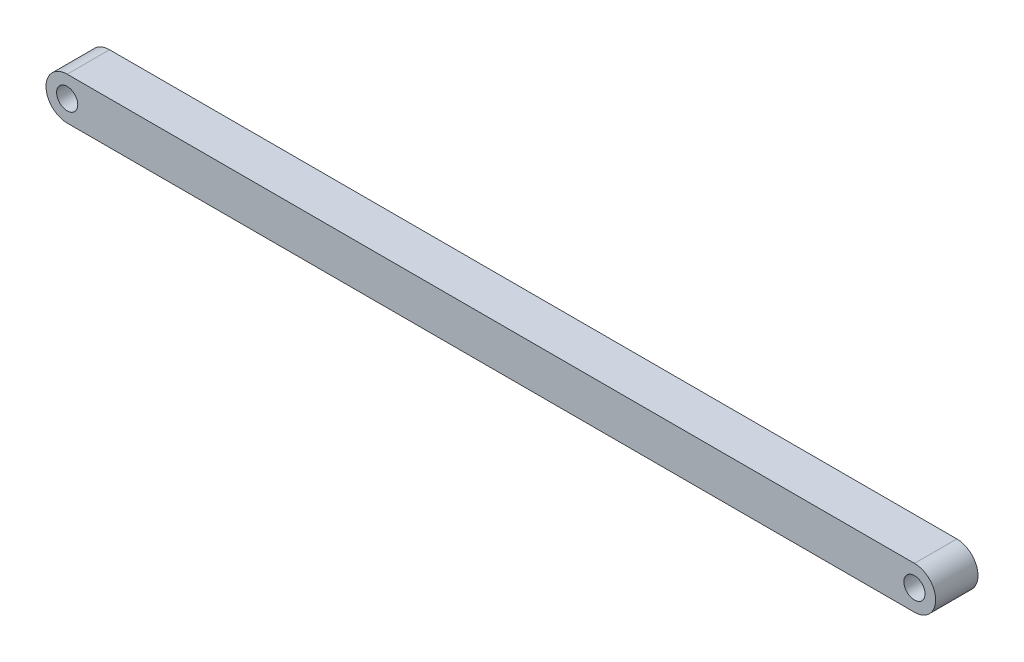
ISO-10303-21;
HEADER;
FILE_DESCRIPTION(('STEP AP214'),'2;1');
FILE_NAME('part.step','',(''),(''),'','','');
FILE_SCHEMA(('AUTOMOTIVE_DESIGN { 1 0 10303 214 1 1 1 1 }'));
ENDSEC;
DATA;
#1=APPLICATION_CONTEXT('core data for automotive mechanical design processes');
#2=APPLICATION_PROTOCOL_DEFINITION('international standard','automotive_design',2000,#1);
#3=PRODUCT_CONTEXT('',#1,'mechanical');
#4=PRODUCT('Part','Part','',(#3));
#5=PRODUCT_RELATED_PRODUCT_CATEGORY('part','',(#4));
#6=PRODUCT_DEFINITION_FORMATION('','',#4);
#7=PRODUCT_DEFINITION_CONTEXT('part definition',#1,'design');
#8=PRODUCT_DEFINITION('design','',#6,#7);
#9=PRODUCT_DEFINITION_SHAPE('','',#8);
#10=(LENGTH_UNIT() NAMED_UNIT(*) SI_UNIT(.MILLI.,.METRE.));
#11=(NAMED_UNIT(*) PLANE_ANGLE_UNIT() SI_UNIT($,.RADIAN.));
#12=(NAMED_UNIT(*) SI_UNIT($,.STERADIAN.) SOLID_ANGLE_UNIT());
#13=UNCERTAINTY_MEASURE_WITH_UNIT(LENGTH_MEASURE(1.E-05),#10,'distance_accuracy_value','');
#14=(GEOMETRIC_REPRESENTATION_CONTEXT(3) GLOBAL_UNCERTAINTY_ASSIGNED_CONTEXT((#13)) GLOBAL_UNIT_ASSIGNED_CONTEXT((#10,
#11,#12)) REPRESENTATION_CONTEXT('',''));
#15=CARTESIAN_POINT('',(0.,0.,0.));
#16=DIRECTION('',(0.,0.,1.));
#17=DIRECTION('',(1.,0.,0.));
#18=AXIS2_PLACEMENT_3D('',#15,#16,#17);
#19=CARTESIAN_POINT('',(-50.,0.,5.));
#20=DIRECTION('',(0.,0.,1.));
#21=DIRECTION('',(1.,0.,0.));
#22=AXIS2_PLACEMENT_3D('',#19,#20,#21);
#23=PLANE('',#22);
#24=CARTESIAN_POINT('',(50.,0.,5.));
#25=DIRECTION('',(0.,0.,1.));
#26=DIRECTION('',(1.,0.,0.));
#27=AXIS2_PLACEMENT_3D('',#24,#25,#26);
#28=CIRCLE('',#27,1.25);
#29=CARTESIAN_POINT('',(51.25,0.,5.));
#30=VERTEX_POINT('',#29);
#31=EDGE_CURVE('E141',#30,#30,#28,.T.);
#32=ORIENTED_EDGE('',*,*,#31,.F.);
#33=EDGE_LOOP('',(#32));
#34=FACE_BOUND('',#33,.T.);
#35=CARTESIAN_POINT('',(-50.,0.,5.));
#36=DIRECTION('',(0.,0.,1.));
#37=DIRECTION('',(1.,0.,0.));
#38=AXIS2_PLACEMENT_3D('',#35,#36,#37);
#39=CIRCLE('',#38,2.5);
#40=CARTESIAN_POINT('',(-50.,2.5,5.));
#41=VERTEX_POINT('',#40);
#42=CARTESIAN_POINT('',(-50.,-2.5,5.));
#43=VERTEX_POINT('',#42);
#44=EDGE_CURVE('E120',#41,#43,#39,.T.);
#45=ORIENTED_EDGE('',*,*,#44,.T.);
#46=DIRECTION('',(1.,0.,0.));
#47=VECTOR('',#46,1.);
#48=CARTESIAN_POINT('',(-50.,-2.5,5.));
#49=LINE('',#48,#47);
#50=CARTESIAN_POINT('',(50.,-2.49999999999998,5.));
#51=VERTEX_POINT('',#50);
#52=EDGE_CURVE('E113',#43,#51,#49,.T.);
#53=ORIENTED_EDGE('',*,*,#52,.T.);
#54=CARTESIAN_POINT('',(50.,0.,5.));
#55=DIRECTION('',(0.,0.,1.));
#56=DIRECTION('',(1.,0.,0.));
#57=AXIS2_PLACEMENT_3D('',#54,#55,#56);
#58=CIRCLE('',#57,2.5);
#59=CARTESIAN_POINT('',(50.,2.50000000000002,5.));
#60=VERTEX_POINT('',#59);
#61=EDGE_CURVE('E119',#51,#60,#58,.T.);
#62=ORIENTED_EDGE('',*,*,#61,.T.);
#63=DIRECTION('',(1.,0.,0.));
#64=VECTOR('',#63,1.);
#65=CARTESIAN_POINT('',(-50.,2.5,5.));
#66=LINE('',#65,#64);
#67=EDGE_CURVE('E132',#41,#60,#66,.T.);
#68=ORIENTED_EDGE('',*,*,#67,.F.);
#69=EDGE_LOOP('',(#45,#53,#62,#68));
#70=FACE_BOUND('',#69,.T.);
#71=CARTESIAN_POINT('',(-50.,0.,5.));
#72=DIRECTION('',(0.,0.,1.));
#73=DIRECTION('',(1.,0.,0.));
#74=AXIS2_PLACEMENT_3D('',#71,#72,#73);
#75=CIRCLE('',#74,1.25);
#76=CARTESIAN_POINT('',(-48.75,0.,5.));
#77=VERTEX_POINT('',#76);
#78=EDGE_CURVE('E161',#77,#77,#75,.T.);
#79=ORIENTED_EDGE('',*,*,#78,.F.);
#80=EDGE_LOOP('',(#79));
#81=FACE_BOUND('',#80,.T.);
#82=ADVANCED_FACE('F69',(#34,#70,#81),#23,.T.);
#83=CARTESIAN_POINT('',(-50.,0.,0.));
#84=DIRECTION('',(0.,0.,1.));
#85=DIRECTION('',(1.,0.,0.));
#86=AXIS2_PLACEMENT_3D('',#83,#84,#85);
#87=PLANE('',#86);
#88=CARTESIAN_POINT('',(-50.,0.,0.));
#89=DIRECTION('',(0.,0.,1.));
#90=DIRECTION('',(1.,0.,0.));
#91=AXIS2_PLACEMENT_3D('',#88,#89,#90);
#92=CIRCLE('',#91,2.5);
#93=CARTESIAN_POINT('',(-50.,2.5,0.));
#94=VERTEX_POINT('',#93);
#95=CARTESIAN_POINT('',(-50.,-2.5,0.));
#96=VERTEX_POINT('',#95);
#97=EDGE_CURVE('E138',#94,#96,#92,.T.);
#98=ORIENTED_EDGE('',*,*,#97,.F.);
#99=DIRECTION('',(1.,0.,0.));
#100=VECTOR('',#99,1.);
#101=CARTESIAN_POINT('',(-50.,2.5,0.));
#102=LINE('',#101,#100);
#103=CARTESIAN_POINT('',(50.,2.50000000000002,0.));
#104=VERTEX_POINT('',#103);
#105=EDGE_CURVE('E147',#94,#104,#102,.T.);
#106=ORIENTED_EDGE('',*,*,#105,.T.);
#107=CARTESIAN_POINT('',(50.,0.,0.));
#108=DIRECTION('',(0.,0.,1.));
#109=DIRECTION('',(1.,0.,0.));
#110=AXIS2_PLACEMENT_3D('',#107,#108,#109);
#111=CIRCLE('',#110,2.5);
#112=CARTESIAN_POINT('',(50.,-2.49999999999998,0.));
#113=VERTEX_POINT('',#112);
#114=EDGE_CURVE('E144',#113,#104,#111,.T.);
#115=ORIENTED_EDGE('',*,*,#114,.F.);
#116=DIRECTION('',(1.,0.,0.));
#117=VECTOR('',#116,1.);
#118=CARTESIAN_POINT('',(-50.,-2.5,0.));
#119=LINE('',#118,#117);
#120=EDGE_CURVE('E126',#96,#113,#119,.T.);
#121=ORIENTED_EDGE('',*,*,#120,.F.);
#122=EDGE_LOOP('',(#98,#106,#115,#121));
#123=FACE_BOUND('',#122,.T.);
#124=CARTESIAN_POINT('',(50.,0.,0.));
#125=DIRECTION('',(0.,0.,1.));
#126=DIRECTION('',(1.,0.,0.));
#127=AXIS2_PLACEMENT_3D('',#124,#125,#126);
#128=CIRCLE('',#127,1.25);
#129=CARTESIAN_POINT('',(51.25,0.,0.));
#130=VERTEX_POINT('',#129);
#131=EDGE_CURVE('E157',#130,#130,#128,.T.);
#132=ORIENTED_EDGE('',*,*,#131,.T.);
#133=EDGE_LOOP('',(#132));
#134=FACE_BOUND('',#133,.T.);
#135=CARTESIAN_POINT('',(-50.,0.,0.));
#136=DIRECTION('',(0.,0.,1.));
#137=DIRECTION('',(1.,0.,0.));
#138=AXIS2_PLACEMENT_3D('',#135,#136,#137);
#139=CIRCLE('',#138,1.25);
#140=CARTESIAN_POINT('',(-48.75,0.,0.));
#141=VERTEX_POINT('',#140);
#142=EDGE_CURVE('E165',#141,#141,#139,.T.);
#143=ORIENTED_EDGE('',*,*,#142,.T.);
#144=EDGE_LOOP('',(#143));
#145=FACE_BOUND('',#144,.T.);
#146=ADVANCED_FACE('F176',(#123,#134,#145),#87,.F.);
#147=CARTESIAN_POINT('',(-50.,0.,5.));
#148=DIRECTION('',(0.,0.,-1.));
#149=DIRECTION('',(-1.,0.,0.));
#150=AXIS2_PLACEMENT_3D('',#147,#148,#149);
#151=CYLINDRICAL_SURFACE('',#150,2.5);
#152=ORIENTED_EDGE('',*,*,#97,.T.);
#153=DIRECTION('',(0.,0.,-1.));
#154=VECTOR('',#153,1.);
#155=CARTESIAN_POINT('',(-50.,-2.5,5.));
#156=LINE('',#155,#154);
#157=EDGE_CURVE('E12',#43,#96,#156,.T.);
#158=ORIENTED_EDGE('',*,*,#157,.F.);
#159=ORIENTED_EDGE('',*,*,#44,.F.);
#160=DIRECTION('',(0.,0.,-1.));
#161=VECTOR('',#160,1.);
#162=CARTESIAN_POINT('',(-50.,2.5,5.));
#163=LINE('',#162,#161);
#164=EDGE_CURVE('E87',#41,#94,#163,.T.);
#165=ORIENTED_EDGE('',*,*,#164,.T.);
#166=EDGE_LOOP('',(#152,#158,#159,#165));
#167=FACE_BOUND('',#166,.T.);
#168=ADVANCED_FACE('F71',(#167),#151,.T.);
#169=CARTESIAN_POINT('',(-50.,-2.5,5.));
#170=DIRECTION('',(0.,1.,0.));
#171=DIRECTION('',(-1.,0.,0.));
#172=AXIS2_PLACEMENT_3D('',#169,#170,#171);
#173=PLANE('',#172);
#174=ORIENTED_EDGE('',*,*,#120,.T.);
#175=DIRECTION('',(0.,0.,-1.));
#176=VECTOR('',#175,1.);
#177=CARTESIAN_POINT('',(50.,-2.49999999999998,5.));
#178=LINE('',#177,#176);
#179=EDGE_CURVE('E79',#51,#113,#178,.T.);
#180=ORIENTED_EDGE('',*,*,#179,.F.);
#181=ORIENTED_EDGE('',*,*,#52,.F.);
#182=ORIENTED_EDGE('',*,*,#157,.T.);
#183=EDGE_LOOP('',(#174,#180,#181,#182));
#184=FACE_BOUND('',#183,.T.);
#185=ADVANCED_FACE('F125',(#184),#173,.F.);
#186=CARTESIAN_POINT('',(50.,0.,5.));
#187=DIRECTION('',(0.,0.,-1.));
#188=DIRECTION('',(-1.,0.,0.));
#189=AXIS2_PLACEMENT_3D('',#186,#187,#188);
#190=CYLINDRICAL_SURFACE('',#189,2.5);
#191=ORIENTED_EDGE('',*,*,#114,.T.);
#192=DIRECTION('',(0.,0.,-1.));
#193=VECTOR('',#192,1.);
#194=CARTESIAN_POINT('',(50.,2.50000000000002,5.));
#195=LINE('',#194,#193);
#196=EDGE_CURVE('E102',#60,#104,#195,.T.);
#197=ORIENTED_EDGE('',*,*,#196,.F.);
#198=ORIENTED_EDGE('',*,*,#61,.F.);
#199=ORIENTED_EDGE('',*,*,#179,.T.);
#200=EDGE_LOOP('',(#191,#197,#198,#199));
#201=FACE_BOUND('',#200,.T.);
#202=ADVANCED_FACE('F130',(#201),#190,.T.);
#203=CARTESIAN_POINT('',(-50.,2.5,5.));
#204=DIRECTION('',(0.,1.,0.));
#205=DIRECTION('',(-1.,0.,0.));
#206=AXIS2_PLACEMENT_3D('',#203,#204,#205);
#207=PLANE('',#206);
#208=ORIENTED_EDGE('',*,*,#105,.F.);
#209=ORIENTED_EDGE('',*,*,#164,.F.);
#210=ORIENTED_EDGE('',*,*,#67,.T.);
#211=ORIENTED_EDGE('',*,*,#196,.T.);
#212=EDGE_LOOP('',(#208,#209,#210,#211));
#213=FACE_BOUND('',#212,.T.);
#214=ADVANCED_FACE('F188',(#213),#207,.T.);
#215=CARTESIAN_POINT('',(50.,0.,5.));
#216=DIRECTION('',(0.,0.,-1.));
#217=DIRECTION('',(-1.,0.,0.));
#218=AXIS2_PLACEMENT_3D('',#215,#216,#217);
#219=CYLINDRICAL_SURFACE('',#218,1.25);
#220=ORIENTED_EDGE('',*,*,#31,.T.);
#221=EDGE_LOOP('',(#220));
#222=FACE_BOUND('',#221,.T.);
#223=ORIENTED_EDGE('',*,*,#131,.F.);
#224=EDGE_LOOP('',(#223));
#225=FACE_BOUND('',#224,.T.);
#226=ADVANCED_FACE('F185',(#222,#225),#219,.F.);
#227=CARTESIAN_POINT('',(-50.,0.,5.));
#228=DIRECTION('',(0.,0.,-1.));
#229=DIRECTION('',(-1.,0.,0.));
#230=AXIS2_PLACEMENT_3D('',#227,#228,#229);
#231=CYLINDRICAL_SURFACE('',#230,1.25);
#232=ORIENTED_EDGE('',*,*,#78,.T.);
#233=EDGE_LOOP('',(#232));
#234=FACE_BOUND('',#233,.T.);
#235=ORIENTED_EDGE('',*,*,#142,.F.);
#236=EDGE_LOOP('',(#235));
#237=FACE_BOUND('',#236,.T.);
#238=ADVANCED_FACE('F173',(#234,#237),#231,.F.);
#239=CLOSED_SHELL('',(#82,#146,#168,#185,#202,#214,#226,#238));
#240=MANIFOLD_SOLID_BREP('B2',#239);
#241=ADVANCED_BREP_SHAPE_REPRESENTATION('',(#18,#240),#14);
#242=SHAPE_DEFINITION_REPRESENTATION(#9,#241);
ENDSEC;
END-ISO-10303-21;
